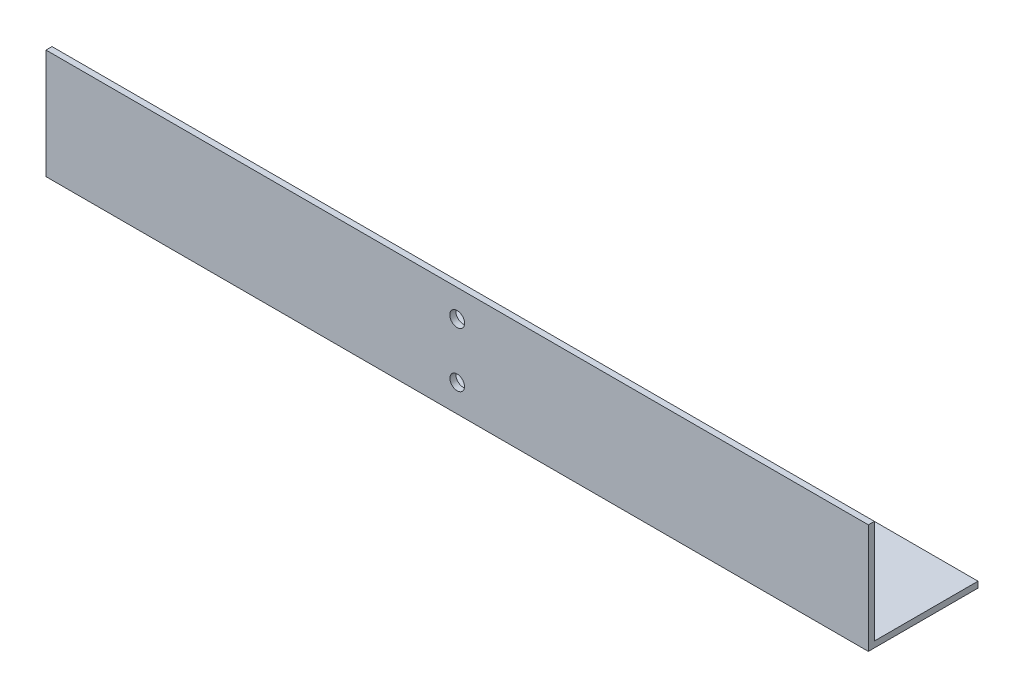
ISO-10303-21;
HEADER;
FILE_DESCRIPTION(('STEP AP214'),'2;1');
FILE_NAME('part.step','',(''),(''),'','','');
FILE_SCHEMA(('AUTOMOTIVE_DESIGN { 1 0 10303 214 1 1 1 1 }'));
ENDSEC;
DATA;
#1=APPLICATION_CONTEXT('core data for automotive mechanical design processes');
#2=APPLICATION_PROTOCOL_DEFINITION('international standard','automotive_design',2000,#1);
#3=PRODUCT_CONTEXT('',#1,'mechanical');
#4=PRODUCT('Part','Part','',(#3));
#5=PRODUCT_RELATED_PRODUCT_CATEGORY('part','',(#4));
#6=PRODUCT_DEFINITION_FORMATION('','',#4);
#7=PRODUCT_DEFINITION_CONTEXT('part definition',#1,'design');
#8=PRODUCT_DEFINITION('design','',#6,#7);
#9=PRODUCT_DEFINITION_SHAPE('','',#8);
#10=(LENGTH_UNIT() NAMED_UNIT(*) SI_UNIT(.MILLI.,.METRE.));
#11=(NAMED_UNIT(*) PLANE_ANGLE_UNIT() SI_UNIT($,.RADIAN.));
#12=(NAMED_UNIT(*) SI_UNIT($,.STERADIAN.) SOLID_ANGLE_UNIT());
#13=UNCERTAINTY_MEASURE_WITH_UNIT(LENGTH_MEASURE(1.E-05),#10,'distance_accuracy_value','');
#14=(GEOMETRIC_REPRESENTATION_CONTEXT(3) GLOBAL_UNCERTAINTY_ASSIGNED_CONTEXT((#13)) GLOBAL_UNIT_ASSIGNED_CONTEXT((#10,
#11,#12)) REPRESENTATION_CONTEXT('',''));
#15=CARTESIAN_POINT('',(0.,0.,0.));
#16=DIRECTION('',(0.,0.,1.));
#17=DIRECTION('',(1.,0.,0.));
#18=AXIS2_PLACEMENT_3D('',#15,#16,#17);
#19=CARTESIAN_POINT('',(190.5,2.794,-25.4));
#20=DIRECTION('',(-1.,0.,0.));
#21=DIRECTION('',(0.,0.,1.));
#22=AXIS2_PLACEMENT_3D('',#19,#20,#21);
#23=PLANE('',#22);
#24=DIRECTION('',(0.,0.,-1.));
#25=VECTOR('',#24,1.);
#26=CARTESIAN_POINT('',(190.5,0.,-25.4));
#27=LINE('',#26,#25);
#28=CARTESIAN_POINT('',(190.5,0.,25.4));
#29=VERTEX_POINT('',#28);
#30=CARTESIAN_POINT('',(190.5,0.,-25.4));
#31=VERTEX_POINT('',#30);
#32=EDGE_CURVE('E91',#29,#31,#27,.T.);
#33=ORIENTED_EDGE('',*,*,#32,.T.);
#34=DIRECTION('',(0.,-1.,0.));
#35=VECTOR('',#34,1.);
#36=CARTESIAN_POINT('',(190.5,2.794,-25.4));
#37=LINE('',#36,#35);
#38=CARTESIAN_POINT('',(190.5,2.794,-25.4));
#39=VERTEX_POINT('',#38);
#40=EDGE_CURVE('E11',#39,#31,#37,.T.);
#41=ORIENTED_EDGE('',*,*,#40,.F.);
#42=DIRECTION('',(0.,0.,-1.));
#43=VECTOR('',#42,1.);
#44=CARTESIAN_POINT('',(190.5,2.794,-25.4));
#45=LINE('',#44,#43);
#46=CARTESIAN_POINT('',(190.5,2.794,22.606));
#47=VERTEX_POINT('',#46);
#48=EDGE_CURVE('E84',#47,#39,#45,.T.);
#49=ORIENTED_EDGE('',*,*,#48,.F.);
#50=DIRECTION('',(0.,-1.,0.));
#51=VECTOR('',#50,1.);
#52=CARTESIAN_POINT('',(190.5,50.8,22.606));
#53=LINE('',#52,#51);
#54=CARTESIAN_POINT('',(190.5,50.8,22.606));
#55=VERTEX_POINT('',#54);
#56=EDGE_CURVE('E99',#55,#47,#53,.T.);
#57=ORIENTED_EDGE('',*,*,#56,.F.);
#58=DIRECTION('',(0.,0.,-1.));
#59=VECTOR('',#58,1.);
#60=CARTESIAN_POINT('',(190.5,50.8,25.4));
#61=LINE('',#60,#59);
#62=CARTESIAN_POINT('',(190.5,50.8,25.4));
#63=VERTEX_POINT('',#62);
#64=EDGE_CURVE('E94',#63,#55,#61,.T.);
#65=ORIENTED_EDGE('',*,*,#64,.F.);
#66=DIRECTION('',(0.,-1.,0.));
#67=VECTOR('',#66,1.);
#68=CARTESIAN_POINT('',(190.5,2.794,25.4));
#69=LINE('',#68,#67);
#70=EDGE_CURVE('E77',#63,#29,#69,.T.);
#71=ORIENTED_EDGE('',*,*,#70,.T.);
#72=EDGE_LOOP('',(#33,#41,#49,#57,#65,#71));
#73=FACE_BOUND('',#72,.T.);
#74=ADVANCED_FACE('F32',(#73),#23,.F.);
#75=CARTESIAN_POINT('',(-190.5,2.794,-25.4));
#76=DIRECTION('',(0.,0.,1.));
#77=DIRECTION('',(1.,0.,0.));
#78=AXIS2_PLACEMENT_3D('',#75,#76,#77);
#79=PLANE('',#78);
#80=DIRECTION('',(-1.,0.,0.));
#81=VECTOR('',#80,1.);
#82=CARTESIAN_POINT('',(-190.5,0.,-25.4));
#83=LINE('',#82,#81);
#84=CARTESIAN_POINT('',(-190.5,0.,-25.4));
#85=VERTEX_POINT('',#84);
#86=EDGE_CURVE('E98',#31,#85,#83,.T.);
#87=ORIENTED_EDGE('',*,*,#86,.T.);
#88=DIRECTION('',(0.,-1.,0.));
#89=VECTOR('',#88,1.);
#90=CARTESIAN_POINT('',(-190.5,2.794,-25.4));
#91=LINE('',#90,#89);
#92=CARTESIAN_POINT('',(-190.5,2.794,-25.4));
#93=VERTEX_POINT('',#92);
#94=EDGE_CURVE('E39',#93,#85,#91,.T.);
#95=ORIENTED_EDGE('',*,*,#94,.F.);
#96=DIRECTION('',(-1.,0.,0.));
#97=VECTOR('',#96,1.);
#98=CARTESIAN_POINT('',(-190.5,2.794,-25.4));
#99=LINE('',#98,#97);
#100=EDGE_CURVE('E52',#39,#93,#99,.T.);
#101=ORIENTED_EDGE('',*,*,#100,.F.);
#102=ORIENTED_EDGE('',*,*,#40,.T.);
#103=EDGE_LOOP('',(#87,#95,#101,#102));
#104=FACE_BOUND('',#103,.T.);
#105=ADVANCED_FACE('F115',(#104),#79,.F.);
#106=CARTESIAN_POINT('',(-190.5,2.794,-25.4));
#107=DIRECTION('',(1.,0.,0.));
#108=DIRECTION('',(0.,0.,-1.));
#109=AXIS2_PLACEMENT_3D('',#106,#107,#108);
#110=PLANE('',#109);
#111=DIRECTION('',(0.,0.,1.));
#112=VECTOR('',#111,1.);
#113=CARTESIAN_POINT('',(-190.5,0.,-25.4));
#114=LINE('',#113,#112);
#115=CARTESIAN_POINT('',(-190.5,0.,25.4));
#116=VERTEX_POINT('',#115);
#117=EDGE_CURVE('E85',#85,#116,#114,.T.);
#118=ORIENTED_EDGE('',*,*,#117,.T.);
#119=DIRECTION('',(0.,-1.,0.));
#120=VECTOR('',#119,1.);
#121=CARTESIAN_POINT('',(-190.5,2.794,25.4));
#122=LINE('',#121,#120);
#123=CARTESIAN_POINT('',(-190.5,50.8,25.4));
#124=VERTEX_POINT('',#123);
#125=EDGE_CURVE('E80',#124,#116,#122,.T.);
#126=ORIENTED_EDGE('',*,*,#125,.F.);
#127=DIRECTION('',(0.,0.,1.));
#128=VECTOR('',#127,1.);
#129=CARTESIAN_POINT('',(-190.5,50.8,25.4));
#130=LINE('',#129,#128);
#131=CARTESIAN_POINT('',(-190.5,50.8,22.606));
#132=VERTEX_POINT('',#131);
#133=EDGE_CURVE('E135',#132,#124,#130,.T.);
#134=ORIENTED_EDGE('',*,*,#133,.F.);
#135=DIRECTION('',(0.,-1.,0.));
#136=VECTOR('',#135,1.);
#137=CARTESIAN_POINT('',(-190.5,50.8,22.606));
#138=LINE('',#137,#136);
#139=CARTESIAN_POINT('',(-190.5,2.794,22.606));
#140=VERTEX_POINT('',#139);
#141=EDGE_CURVE('E103',#132,#140,#138,.T.);
#142=ORIENTED_EDGE('',*,*,#141,.T.);
#143=DIRECTION('',(0.,0.,1.));
#144=VECTOR('',#143,1.);
#145=CARTESIAN_POINT('',(-190.5,2.794,-25.4));
#146=LINE('',#145,#144);
#147=EDGE_CURVE('E95',#93,#140,#146,.T.);
#148=ORIENTED_EDGE('',*,*,#147,.F.);
#149=ORIENTED_EDGE('',*,*,#94,.T.);
#150=EDGE_LOOP('',(#118,#126,#134,#142,#148,#149));
#151=FACE_BOUND('',#150,.T.);
#152=ADVANCED_FACE('F112',(#151),#110,.F.);
#153=CARTESIAN_POINT('',(-190.5,2.794,25.4));
#154=DIRECTION('',(0.,0.,-1.));
#155=DIRECTION('',(-1.,0.,0.));
#156=AXIS2_PLACEMENT_3D('',#153,#154,#155);
#157=PLANE('',#156);
#158=CARTESIAN_POINT('',(0.,38.1,25.4));
#159=DIRECTION('',(0.,0.,1.));
#160=DIRECTION('',(1.,0.,0.));
#161=AXIS2_PLACEMENT_3D('',#158,#159,#160);
#162=CIRCLE('',#161,3.429);
#163=CARTESIAN_POINT('',(3.429,38.1,25.4));
#164=VERTEX_POINT('',#163);
#165=EDGE_CURVE('E148',#164,#164,#162,.T.);
#166=ORIENTED_EDGE('',*,*,#165,.F.);
#167=EDGE_LOOP('',(#166));
#168=FACE_BOUND('',#167,.T.);
#169=CARTESIAN_POINT('',(0.,12.7,25.4));
#170=DIRECTION('',(0.,0.,1.));
#171=DIRECTION('',(1.,0.,0.));
#172=AXIS2_PLACEMENT_3D('',#169,#170,#171);
#173=CIRCLE('',#172,3.3734375);
#174=CARTESIAN_POINT('',(3.3734375,12.7,25.4));
#175=VERTEX_POINT('',#174);
#176=EDGE_CURVE('E149',#175,#175,#173,.T.);
#177=ORIENTED_EDGE('',*,*,#176,.F.);
#178=EDGE_LOOP('',(#177));
#179=FACE_BOUND('',#178,.T.);
#180=DIRECTION('',(1.,0.,0.));
#181=VECTOR('',#180,1.);
#182=CARTESIAN_POINT('',(-190.5,0.,25.4));
#183=LINE('',#182,#181);
#184=EDGE_CURVE('E72',#116,#29,#183,.T.);
#185=ORIENTED_EDGE('',*,*,#184,.T.);
#186=ORIENTED_EDGE('',*,*,#70,.F.);
#187=DIRECTION('',(1.,0.,0.));
#188=VECTOR('',#187,1.);
#189=CARTESIAN_POINT('',(-190.5,50.8,25.4));
#190=LINE('',#189,#188);
#191=EDGE_CURVE('E131',#124,#63,#190,.T.);
#192=ORIENTED_EDGE('',*,*,#191,.F.);
#193=ORIENTED_EDGE('',*,*,#125,.T.);
#194=EDGE_LOOP('',(#185,#186,#192,#193));
#195=FACE_BOUND('',#194,.T.);
#196=ADVANCED_FACE('F74',(#168,#179,#195),#157,.F.);
#197=CARTESIAN_POINT('',(0.,2.794,0.));
#198=DIRECTION('',(0.,1.,0.));
#199=DIRECTION('',(0.,0.,1.));
#200=AXIS2_PLACEMENT_3D('',#197,#198,#199);
#201=PLANE('',#200);
#202=DIRECTION('',(-1.,0.,0.));
#203=VECTOR('',#202,1.);
#204=CARTESIAN_POINT('',(-190.5,2.794,22.606));
#205=LINE('',#204,#203);
#206=EDGE_CURVE('E46',#47,#140,#205,.T.);
#207=ORIENTED_EDGE('',*,*,#206,.F.);
#208=ORIENTED_EDGE('',*,*,#48,.T.);
#209=ORIENTED_EDGE('',*,*,#100,.T.);
#210=ORIENTED_EDGE('',*,*,#147,.T.);
#211=EDGE_LOOP('',(#207,#208,#209,#210));
#212=FACE_BOUND('',#211,.T.);
#213=ADVANCED_FACE('F137',(#212),#201,.T.);
#214=CARTESIAN_POINT('',(0.,0.,0.));
#215=DIRECTION('',(0.,1.,0.));
#216=DIRECTION('',(0.,0.,1.));
#217=AXIS2_PLACEMENT_3D('',#214,#215,#216);
#218=PLANE('',#217);
#219=ORIENTED_EDGE('',*,*,#32,.F.);
#220=ORIENTED_EDGE('',*,*,#184,.F.);
#221=ORIENTED_EDGE('',*,*,#117,.F.);
#222=ORIENTED_EDGE('',*,*,#86,.F.);
#223=EDGE_LOOP('',(#219,#220,#221,#222));
#224=FACE_BOUND('',#223,.T.);
#225=ADVANCED_FACE('F97',(#224),#218,.F.);
#226=CARTESIAN_POINT('',(-190.5,50.8,22.606));
#227=DIRECTION('',(0.,0.,1.));
#228=DIRECTION('',(1.,0.,0.));
#229=AXIS2_PLACEMENT_3D('',#226,#227,#228);
#230=PLANE('',#229);
#231=CARTESIAN_POINT('',(0.,38.1,22.606));
#232=DIRECTION('',(0.,0.,1.));
#233=DIRECTION('',(1.,0.,0.));
#234=AXIS2_PLACEMENT_3D('',#231,#232,#233);
#235=CIRCLE('',#234,3.429);
#236=CARTESIAN_POINT('',(3.429,38.1,22.606));
#237=VERTEX_POINT('',#236);
#238=EDGE_CURVE('E136',#237,#237,#235,.F.);
#239=ORIENTED_EDGE('',*,*,#238,.F.);
#240=EDGE_LOOP('',(#239));
#241=FACE_BOUND('',#240,.T.);
#242=CARTESIAN_POINT('',(0.,12.7,22.606));
#243=DIRECTION('',(0.,0.,1.));
#244=DIRECTION('',(1.,0.,0.));
#245=AXIS2_PLACEMENT_3D('',#242,#243,#244);
#246=CIRCLE('',#245,3.3734375);
#247=CARTESIAN_POINT('',(3.3734375,12.7,22.606));
#248=VERTEX_POINT('',#247);
#249=EDGE_CURVE('E145',#248,#248,#246,.F.);
#250=ORIENTED_EDGE('',*,*,#249,.F.);
#251=EDGE_LOOP('',(#250));
#252=FACE_BOUND('',#251,.T.);
#253=ORIENTED_EDGE('',*,*,#206,.T.);
#254=ORIENTED_EDGE('',*,*,#141,.F.);
#255=DIRECTION('',(-1.,0.,0.));
#256=VECTOR('',#255,1.);
#257=CARTESIAN_POINT('',(-190.5,50.8,22.606));
#258=LINE('',#257,#256);
#259=EDGE_CURVE('E124',#55,#132,#258,.T.);
#260=ORIENTED_EDGE('',*,*,#259,.F.);
#261=ORIENTED_EDGE('',*,*,#56,.T.);
#262=EDGE_LOOP('',(#253,#254,#260,#261));
#263=FACE_BOUND('',#262,.T.);
#264=ADVANCED_FACE('F120',(#241,#252,#263),#230,.F.);
#265=CARTESIAN_POINT('',(0.,50.8,0.));
#266=DIRECTION('',(0.,-1.,0.));
#267=DIRECTION('',(0.,0.,-1.));
#268=AXIS2_PLACEMENT_3D('',#265,#266,#267);
#269=PLANE('',#268);
#270=ORIENTED_EDGE('',*,*,#133,.T.);
#271=ORIENTED_EDGE('',*,*,#191,.T.);
#272=ORIENTED_EDGE('',*,*,#64,.T.);
#273=ORIENTED_EDGE('',*,*,#259,.T.);
#274=EDGE_LOOP('',(#270,#271,#272,#273));
#275=FACE_BOUND('',#274,.T.);
#276=ADVANCED_FACE('F142',(#275),#269,.F.);
#277=CARTESIAN_POINT('',(0.,12.7,12.9073233892453));
#278=DIRECTION('',(0.,0.,1.));
#279=DIRECTION('',(1.,0.,0.));
#280=AXIS2_PLACEMENT_3D('',#277,#278,#279);
#281=CYLINDRICAL_SURFACE('',#280,3.3734375);
#282=ORIENTED_EDGE('',*,*,#249,.T.);
#283=EDGE_LOOP('',(#282));
#284=FACE_BOUND('',#283,.T.);
#285=ORIENTED_EDGE('',*,*,#176,.T.);
#286=EDGE_LOOP('',(#285));
#287=FACE_BOUND('',#286,.T.);
#288=ADVANCED_FACE('F164',(#284,#287),#281,.F.);
#289=CARTESIAN_POINT('',(0.,38.1,12.9073233892453));
#290=DIRECTION('',(0.,0.,1.));
#291=DIRECTION('',(1.,0.,0.));
#292=AXIS2_PLACEMENT_3D('',#289,#290,#291);
#293=CYLINDRICAL_SURFACE('',#292,3.429);
#294=ORIENTED_EDGE('',*,*,#238,.T.);
#295=EDGE_LOOP('',(#294));
#296=FACE_BOUND('',#295,.T.);
#297=ORIENTED_EDGE('',*,*,#165,.T.);
#298=EDGE_LOOP('',(#297));
#299=FACE_BOUND('',#298,.T.);
#300=ADVANCED_FACE('F157',(#296,#299),#293,.F.);
#301=CLOSED_SHELL('',(#74,#105,#152,#196,#213,#225,#264,#276,#288,#300));
#302=MANIFOLD_SOLID_BREP('B2',#301);
#303=ADVANCED_BREP_SHAPE_REPRESENTATION('',(#18,#302),#14);
#304=SHAPE_DEFINITION_REPRESENTATION(#9,#303);
ENDSEC;
END-ISO-10303-21;
